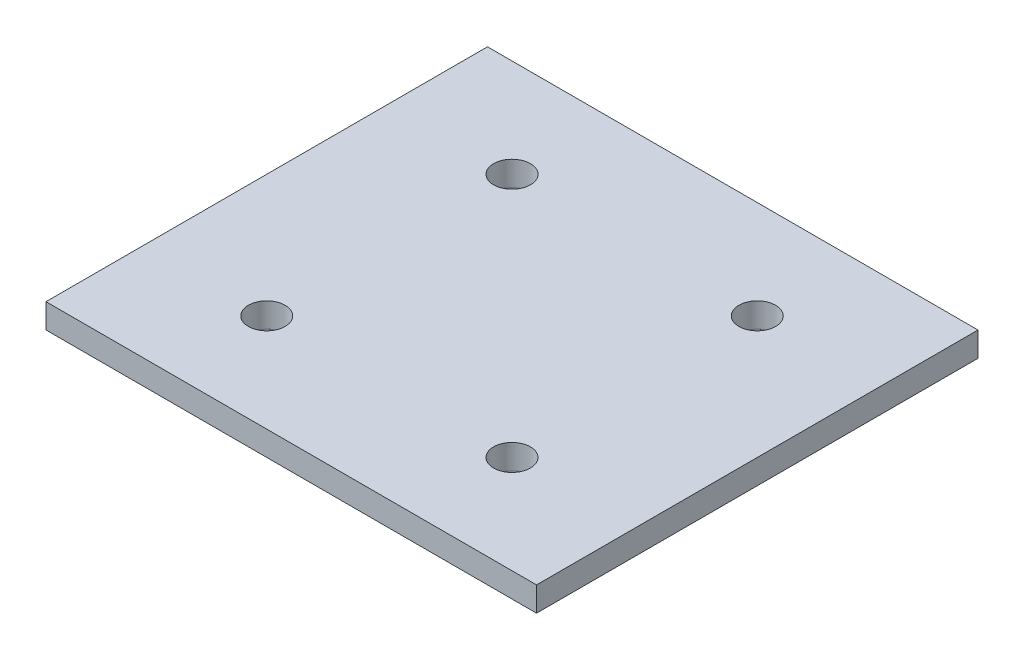
ISO-10303-21;
HEADER;
FILE_DESCRIPTION(('STEP AP214'),'2;1');
FILE_NAME('part.step','',(''),(''),'','','');
FILE_SCHEMA(('AUTOMOTIVE_DESIGN { 1 0 10303 214 1 1 1 1 }'));
ENDSEC;
DATA;
#1=APPLICATION_CONTEXT('core data for automotive mechanical design processes');
#2=APPLICATION_PROTOCOL_DEFINITION('international standard','automotive_design',2000,#1);
#3=PRODUCT_CONTEXT('',#1,'mechanical');
#4=PRODUCT('Part','Part','',(#3));
#5=PRODUCT_RELATED_PRODUCT_CATEGORY('part','',(#4));
#6=PRODUCT_DEFINITION_FORMATION('','',#4);
#7=PRODUCT_DEFINITION_CONTEXT('part definition',#1,'design');
#8=PRODUCT_DEFINITION('design','',#6,#7);
#9=PRODUCT_DEFINITION_SHAPE('','',#8);
#10=(LENGTH_UNIT() NAMED_UNIT(*) SI_UNIT(.MILLI.,.METRE.));
#11=(NAMED_UNIT(*) PLANE_ANGLE_UNIT() SI_UNIT($,.RADIAN.));
#12=(NAMED_UNIT(*) SI_UNIT($,.STERADIAN.) SOLID_ANGLE_UNIT());
#13=UNCERTAINTY_MEASURE_WITH_UNIT(LENGTH_MEASURE(1.E-05),#10,'distance_accuracy_value','');
#14=(GEOMETRIC_REPRESENTATION_CONTEXT(3) GLOBAL_UNCERTAINTY_ASSIGNED_CONTEXT((#13)) GLOBAL_UNIT_ASSIGNED_CONTEXT((#10,
#11,#12)) REPRESENTATION_CONTEXT('',''));
#15=CARTESIAN_POINT('',(0.,0.,0.));
#16=DIRECTION('',(0.,0.,1.));
#17=DIRECTION('',(1.,0.,0.));
#18=AXIS2_PLACEMENT_3D('',#15,#16,#17);
#19=CARTESIAN_POINT('',(-10.,-5.,-10.));
#20=DIRECTION('',(0.,1.,0.));
#21=DIRECTION('',(0.,0.,1.));
#22=AXIS2_PLACEMENT_3D('',#19,#20,#21);
#23=PLANE('',#22);
#24=CARTESIAN_POINT('',(-10.,-5.,-10.));
#25=DIRECTION('',(0.,-1.,0.));
#26=DIRECTION('',(0.,0.,1.));
#27=AXIS2_PLACEMENT_3D('',#24,#25,#26);
#28=CIRCLE('',#27,3.);
#29=CARTESIAN_POINT('',(-10.,-5.,-7.));
#30=VERTEX_POINT('',#29);
#31=EDGE_CURVE('E63',#30,#30,#28,.T.);
#32=ORIENTED_EDGE('',*,*,#31,.T.);
#33=EDGE_LOOP('',(#32));
#34=FACE_BOUND('',#33,.T.);
#35=CARTESIAN_POINT('',(-10.,-5.,-10.));
#36=DIRECTION('',(0.,-1.,0.));
#37=DIRECTION('',(0.,0.,1.));
#38=AXIS2_PLACEMENT_3D('',#35,#36,#37);
#39=CIRCLE('',#38,1.50000000000013);
#40=CARTESIAN_POINT('',(-10.,-5.,-8.49999999999987));
#41=VERTEX_POINT('',#40);
#42=EDGE_CURVE('E54',#41,#41,#39,.T.);
#43=ORIENTED_EDGE('',*,*,#42,.F.);
#44=EDGE_LOOP('',(#43));
#45=FACE_BOUND('',#44,.T.);
#46=ADVANCED_FACE('F50',(#34,#45),#23,.F.);
#47=CARTESIAN_POINT('',(-10.,0.,-10.));
#48=DIRECTION('',(0.,1.,0.));
#49=DIRECTION('',(0.,0.,1.));
#50=AXIS2_PLACEMENT_3D('',#47,#48,#49);
#51=PLANE('',#50);
#52=CARTESIAN_POINT('',(-10.,0.,-10.));
#53=DIRECTION('',(0.,-1.,0.));
#54=DIRECTION('',(0.,0.,1.));
#55=AXIS2_PLACEMENT_3D('',#52,#53,#54);
#56=CIRCLE('',#55,3.);
#57=CARTESIAN_POINT('',(-10.,0.,-7.));
#58=VERTEX_POINT('',#57);
#59=EDGE_CURVE('E61',#58,#58,#56,.T.);
#60=ORIENTED_EDGE('',*,*,#59,.F.);
#61=EDGE_LOOP('',(#60));
#62=FACE_BOUND('',#61,.T.);
#63=CARTESIAN_POINT('',(-10.,0.,-10.));
#64=DIRECTION('',(0.,-1.,0.));
#65=DIRECTION('',(0.,0.,1.));
#66=AXIS2_PLACEMENT_3D('',#63,#64,#65);
#67=CIRCLE('',#66,1.50000000000013);
#68=CARTESIAN_POINT('',(-10.,0.,-8.49999999999987));
#69=VERTEX_POINT('',#68);
#70=EDGE_CURVE('E11',#69,#69,#67,.T.);
#71=ORIENTED_EDGE('',*,*,#70,.T.);
#72=EDGE_LOOP('',(#71));
#73=FACE_BOUND('',#72,.T.);
#74=ADVANCED_FACE('F71',(#62,#73),#51,.T.);
#75=CARTESIAN_POINT('',(-10.,-5.,-10.));
#76=DIRECTION('',(0.,1.,0.));
#77=DIRECTION('',(0.,0.,1.));
#78=AXIS2_PLACEMENT_3D('',#75,#76,#77);
#79=CYLINDRICAL_SURFACE('',#78,3.);
#80=ORIENTED_EDGE('',*,*,#31,.F.);
#81=EDGE_LOOP('',(#80));
#82=FACE_BOUND('',#81,.T.);
#83=ORIENTED_EDGE('',*,*,#59,.T.);
#84=EDGE_LOOP('',(#83));
#85=FACE_BOUND('',#84,.T.);
#86=ADVANCED_FACE('F69',(#82,#85),#79,.T.);
#87=CARTESIAN_POINT('',(-10.,-5.,-10.));
#88=DIRECTION('',(0.,1.,0.));
#89=DIRECTION('',(0.,0.,1.));
#90=AXIS2_PLACEMENT_3D('',#87,#88,#89);
#91=CYLINDRICAL_SURFACE('',#90,1.50000000000013);
#92=ORIENTED_EDGE('',*,*,#42,.T.);
#93=EDGE_LOOP('',(#92));
#94=FACE_BOUND('',#93,.T.);
#95=ORIENTED_EDGE('',*,*,#70,.F.);
#96=EDGE_LOOP('',(#95));
#97=FACE_BOUND('',#96,.T.);
#98=ADVANCED_FACE('F52',(#94,#97),#91,.F.);
#99=CLOSED_SHELL('',(#46,#74,#86,#98));
#100=MANIFOLD_SOLID_BREP('B2',#99);
#101=CARTESIAN_POINT('',(10.,-5.,-10.));
#102=DIRECTION('',(0.,-1.,0.));
#103=DIRECTION('',(0.,0.,-1.));
#104=AXIS2_PLACEMENT_3D('',#101,#102,#103);
#105=PLANE('',#104);
#106=CARTESIAN_POINT('',(10.,-5.,-10.));
#107=DIRECTION('',(0.,-1.,0.));
#108=DIRECTION('',(0.,0.,-1.));
#109=AXIS2_PLACEMENT_3D('',#106,#107,#108);
#110=CIRCLE('',#109,3.);
#111=CARTESIAN_POINT('',(10.,-5.,-13.));
#112=VERTEX_POINT('',#111);
#113=EDGE_CURVE('E141',#112,#112,#110,.T.);
#114=ORIENTED_EDGE('',*,*,#113,.T.);
#115=EDGE_LOOP('',(#114));
#116=FACE_BOUND('',#115,.T.);
#117=CARTESIAN_POINT('',(10.,-5.,-10.));
#118=DIRECTION('',(0.,-1.,0.));
#119=DIRECTION('',(0.,0.,-1.));
#120=AXIS2_PLACEMENT_3D('',#117,#118,#119);
#121=CIRCLE('',#120,1.50000000000013);
#122=CARTESIAN_POINT('',(10.,-5.,-11.5000000000001));
#123=VERTEX_POINT('',#122);
#124=EDGE_CURVE('E132',#123,#123,#121,.T.);
#125=ORIENTED_EDGE('',*,*,#124,.F.);
#126=EDGE_LOOP('',(#125));
#127=FACE_BOUND('',#126,.T.);
#128=ADVANCED_FACE('F128',(#116,#127),#105,.T.);
#129=CARTESIAN_POINT('',(10.,0.,-10.));
#130=DIRECTION('',(0.,-1.,0.));
#131=DIRECTION('',(0.,0.,-1.));
#132=AXIS2_PLACEMENT_3D('',#129,#130,#131);
#133=PLANE('',#132);
#134=CARTESIAN_POINT('',(10.,0.,-10.));
#135=DIRECTION('',(0.,-1.,0.));
#136=DIRECTION('',(0.,0.,-1.));
#137=AXIS2_PLACEMENT_3D('',#134,#135,#136);
#138=CIRCLE('',#137,3.);
#139=CARTESIAN_POINT('',(10.,0.,-13.));
#140=VERTEX_POINT('',#139);
#141=EDGE_CURVE('E139',#140,#140,#138,.T.);
#142=ORIENTED_EDGE('',*,*,#141,.F.);
#143=EDGE_LOOP('',(#142));
#144=FACE_BOUND('',#143,.T.);
#145=CARTESIAN_POINT('',(10.,0.,-10.));
#146=DIRECTION('',(0.,-1.,0.));
#147=DIRECTION('',(0.,0.,-1.));
#148=AXIS2_PLACEMENT_3D('',#145,#146,#147);
#149=CIRCLE('',#148,1.50000000000013);
#150=CARTESIAN_POINT('',(10.,0.,-11.5000000000001));
#151=VERTEX_POINT('',#150);
#152=EDGE_CURVE('E49',#151,#151,#149,.T.);
#153=ORIENTED_EDGE('',*,*,#152,.T.);
#154=EDGE_LOOP('',(#153));
#155=FACE_BOUND('',#154,.T.);
#156=ADVANCED_FACE('F149',(#144,#155),#133,.F.);
#157=CARTESIAN_POINT('',(10.,-5.,-10.));
#158=DIRECTION('',(0.,1.,0.));
#159=DIRECTION('',(0.,0.,1.));
#160=AXIS2_PLACEMENT_3D('',#157,#158,#159);
#161=CYLINDRICAL_SURFACE('',#160,3.);
#162=ORIENTED_EDGE('',*,*,#113,.F.);
#163=EDGE_LOOP('',(#162));
#164=FACE_BOUND('',#163,.T.);
#165=ORIENTED_EDGE('',*,*,#141,.T.);
#166=EDGE_LOOP('',(#165));
#167=FACE_BOUND('',#166,.T.);
#168=ADVANCED_FACE('F147',(#164,#167),#161,.T.);
#169=CARTESIAN_POINT('',(10.,-5.,-10.));
#170=DIRECTION('',(0.,1.,0.));
#171=DIRECTION('',(0.,0.,1.));
#172=AXIS2_PLACEMENT_3D('',#169,#170,#171);
#173=CYLINDRICAL_SURFACE('',#172,1.50000000000013);
#174=ORIENTED_EDGE('',*,*,#124,.T.);
#175=EDGE_LOOP('',(#174));
#176=FACE_BOUND('',#175,.T.);
#177=ORIENTED_EDGE('',*,*,#152,.F.);
#178=EDGE_LOOP('',(#177));
#179=FACE_BOUND('',#178,.T.);
#180=ADVANCED_FACE('F130',(#176,#179),#173,.F.);
#181=CLOSED_SHELL('',(#128,#156,#168,#180));
#182=MANIFOLD_SOLID_BREP('B6',#181);
#183=CARTESIAN_POINT('',(10.,-5.,10.));
#184=DIRECTION('',(0.,1.,0.));
#185=DIRECTION('',(0.,0.,1.));
#186=AXIS2_PLACEMENT_3D('',#183,#184,#185);
#187=PLANE('',#186);
#188=CARTESIAN_POINT('',(10.,-5.,10.));
#189=DIRECTION('',(0.,-1.,0.));
#190=DIRECTION('',(0.,0.,1.));
#191=AXIS2_PLACEMENT_3D('',#188,#189,#190);
#192=CIRCLE('',#191,3.);
#193=CARTESIAN_POINT('',(10.,-5.,13.));
#194=VERTEX_POINT('',#193);
#195=EDGE_CURVE('E219',#194,#194,#192,.T.);
#196=ORIENTED_EDGE('',*,*,#195,.T.);
#197=EDGE_LOOP('',(#196));
#198=FACE_BOUND('',#197,.T.);
#199=CARTESIAN_POINT('',(10.,-5.,10.));
#200=DIRECTION('',(0.,-1.,0.));
#201=DIRECTION('',(0.,0.,1.));
#202=AXIS2_PLACEMENT_3D('',#199,#200,#201);
#203=CIRCLE('',#202,1.50000000000013);
#204=CARTESIAN_POINT('',(10.,-5.,11.5000000000001));
#205=VERTEX_POINT('',#204);
#206=EDGE_CURVE('E210',#205,#205,#203,.T.);
#207=ORIENTED_EDGE('',*,*,#206,.F.);
#208=EDGE_LOOP('',(#207));
#209=FACE_BOUND('',#208,.T.);
#210=ADVANCED_FACE('F206',(#198,#209),#187,.F.);
#211=CARTESIAN_POINT('',(10.,0.,10.));
#212=DIRECTION('',(0.,1.,0.));
#213=DIRECTION('',(0.,0.,1.));
#214=AXIS2_PLACEMENT_3D('',#211,#212,#213);
#215=PLANE('',#214);
#216=CARTESIAN_POINT('',(10.,0.,10.));
#217=DIRECTION('',(0.,-1.,0.));
#218=DIRECTION('',(0.,0.,1.));
#219=AXIS2_PLACEMENT_3D('',#216,#217,#218);
#220=CIRCLE('',#219,3.);
#221=CARTESIAN_POINT('',(10.,0.,13.));
#222=VERTEX_POINT('',#221);
#223=EDGE_CURVE('E217',#222,#222,#220,.T.);
#224=ORIENTED_EDGE('',*,*,#223,.F.);
#225=EDGE_LOOP('',(#224));
#226=FACE_BOUND('',#225,.T.);
#227=CARTESIAN_POINT('',(10.,0.,10.));
#228=DIRECTION('',(0.,-1.,0.));
#229=DIRECTION('',(0.,0.,1.));
#230=AXIS2_PLACEMENT_3D('',#227,#228,#229);
#231=CIRCLE('',#230,1.50000000000013);
#232=CARTESIAN_POINT('',(10.,0.,11.5000000000001));
#233=VERTEX_POINT('',#232);
#234=EDGE_CURVE('E127',#233,#233,#231,.T.);
#235=ORIENTED_EDGE('',*,*,#234,.T.);
#236=EDGE_LOOP('',(#235));
#237=FACE_BOUND('',#236,.T.);
#238=ADVANCED_FACE('F227',(#226,#237),#215,.T.);
#239=CARTESIAN_POINT('',(10.,-5.,10.));
#240=DIRECTION('',(0.,1.,0.));
#241=DIRECTION('',(0.,0.,1.));
#242=AXIS2_PLACEMENT_3D('',#239,#240,#241);
#243=CYLINDRICAL_SURFACE('',#242,3.);
#244=ORIENTED_EDGE('',*,*,#195,.F.);
#245=EDGE_LOOP('',(#244));
#246=FACE_BOUND('',#245,.T.);
#247=ORIENTED_EDGE('',*,*,#223,.T.);
#248=EDGE_LOOP('',(#247));
#249=FACE_BOUND('',#248,.T.);
#250=ADVANCED_FACE('F225',(#246,#249),#243,.T.);
#251=CARTESIAN_POINT('',(10.,-5.,10.));
#252=DIRECTION('',(0.,1.,0.));
#253=DIRECTION('',(0.,0.,1.));
#254=AXIS2_PLACEMENT_3D('',#251,#252,#253);
#255=CYLINDRICAL_SURFACE('',#254,1.50000000000013);
#256=ORIENTED_EDGE('',*,*,#206,.T.);
#257=EDGE_LOOP('',(#256));
#258=FACE_BOUND('',#257,.T.);
#259=ORIENTED_EDGE('',*,*,#234,.F.);
#260=EDGE_LOOP('',(#259));
#261=FACE_BOUND('',#260,.T.);
#262=ADVANCED_FACE('F208',(#258,#261),#255,.F.);
#263=CLOSED_SHELL('',(#210,#238,#250,#262));
#264=MANIFOLD_SOLID_BREP('B44',#263);
#265=CARTESIAN_POINT('',(-10.,-5.,10.));
#266=DIRECTION('',(0.,-1.,0.));
#267=DIRECTION('',(0.,0.,-1.));
#268=AXIS2_PLACEMENT_3D('',#265,#266,#267);
#269=PLANE('',#268);
#270=CARTESIAN_POINT('',(-10.,-5.,10.));
#271=DIRECTION('',(0.,-1.,0.));
#272=DIRECTION('',(0.,0.,-1.));
#273=AXIS2_PLACEMENT_3D('',#270,#271,#272);
#274=CIRCLE('',#273,3.);
#275=CARTESIAN_POINT('',(-10.,-5.,7.));
#276=VERTEX_POINT('',#275);
#277=EDGE_CURVE('E205',#276,#276,#274,.T.);
#278=ORIENTED_EDGE('',*,*,#277,.T.);
#279=EDGE_LOOP('',(#278));
#280=FACE_BOUND('',#279,.T.);
#281=CARTESIAN_POINT('',(-10.,-5.,10.));
#282=DIRECTION('',(0.,-1.,0.));
#283=DIRECTION('',(0.,0.,-1.));
#284=AXIS2_PLACEMENT_3D('',#281,#282,#283);
#285=CIRCLE('',#284,1.50000000000013);
#286=CARTESIAN_POINT('',(-10.,-5.,8.49999999999987));
#287=VERTEX_POINT('',#286);
#288=EDGE_CURVE('E296',#287,#287,#285,.T.);
#289=ORIENTED_EDGE('',*,*,#288,.F.);
#290=EDGE_LOOP('',(#289));
#291=FACE_BOUND('',#290,.T.);
#292=ADVANCED_FACE('F285',(#280,#291),#269,.T.);
#293=CARTESIAN_POINT('',(-10.,0.,10.));
#294=DIRECTION('',(0.,-1.,0.));
#295=DIRECTION('',(0.,0.,-1.));
#296=AXIS2_PLACEMENT_3D('',#293,#294,#295);
#297=PLANE('',#296);
#298=CARTESIAN_POINT('',(-10.,0.,10.));
#299=DIRECTION('',(0.,-1.,0.));
#300=DIRECTION('',(0.,0.,-1.));
#301=AXIS2_PLACEMENT_3D('',#298,#299,#300);
#302=CIRCLE('',#301,3.);
#303=CARTESIAN_POINT('',(-10.,0.,7.));
#304=VERTEX_POINT('',#303);
#305=EDGE_CURVE('E289',#304,#304,#302,.T.);
#306=ORIENTED_EDGE('',*,*,#305,.F.);
#307=EDGE_LOOP('',(#306));
#308=FACE_BOUND('',#307,.T.);
#309=CARTESIAN_POINT('',(-10.,0.,10.));
#310=DIRECTION('',(0.,-1.,0.));
#311=DIRECTION('',(0.,0.,-1.));
#312=AXIS2_PLACEMENT_3D('',#309,#310,#311);
#313=CIRCLE('',#312,1.50000000000013);
#314=CARTESIAN_POINT('',(-10.,0.,8.49999999999987));
#315=VERTEX_POINT('',#314);
#316=EDGE_CURVE('E298',#315,#315,#313,.T.);
#317=ORIENTED_EDGE('',*,*,#316,.T.);
#318=EDGE_LOOP('',(#317));
#319=FACE_BOUND('',#318,.T.);
#320=ADVANCED_FACE('F308',(#308,#319),#297,.F.);
#321=CARTESIAN_POINT('',(-10.,-5.,10.));
#322=DIRECTION('',(0.,1.,0.));
#323=DIRECTION('',(0.,0.,1.));
#324=AXIS2_PLACEMENT_3D('',#321,#322,#323);
#325=CYLINDRICAL_SURFACE('',#324,3.);
#326=ORIENTED_EDGE('',*,*,#277,.F.);
#327=EDGE_LOOP('',(#326));
#328=FACE_BOUND('',#327,.T.);
#329=ORIENTED_EDGE('',*,*,#305,.T.);
#330=EDGE_LOOP('',(#329));
#331=FACE_BOUND('',#330,.T.);
#332=ADVANCED_FACE('F287',(#328,#331),#325,.T.);
#333=CARTESIAN_POINT('',(-10.,-5.,10.));
#334=DIRECTION('',(0.,1.,0.));
#335=DIRECTION('',(0.,0.,1.));
#336=AXIS2_PLACEMENT_3D('',#333,#334,#335);
#337=CYLINDRICAL_SURFACE('',#336,1.50000000000013);
#338=ORIENTED_EDGE('',*,*,#288,.T.);
#339=EDGE_LOOP('',(#338));
#340=FACE_BOUND('',#339,.T.);
#341=ORIENTED_EDGE('',*,*,#316,.F.);
#342=EDGE_LOOP('',(#341));
#343=FACE_BOUND('',#342,.T.);
#344=ADVANCED_FACE('F304',(#340,#343),#337,.F.);
#345=CLOSED_SHELL('',(#292,#320,#332,#344));
#346=MANIFOLD_SOLID_BREP('B122',#345);
#347=CARTESIAN_POINT('',(0.,2.,0.));
#348=DIRECTION('',(0.,1.,0.));
#349=DIRECTION('',(0.,0.,1.));
#350=AXIS2_PLACEMENT_3D('',#347,#348,#349);
#351=PLANE('',#350);
#352=CARTESIAN_POINT('',(10.,2.,10.));
#353=DIRECTION('',(0.,1.,0.));
#354=DIRECTION('',(0.,0.,1.));
#355=AXIS2_PLACEMENT_3D('',#352,#353,#354);
#356=CIRCLE('',#355,1.50000000000009);
#357=CARTESIAN_POINT('',(10.,2.,11.5000000000001));
#358=VERTEX_POINT('',#357);
#359=EDGE_CURVE('E458',#358,#358,#356,.T.);
#360=ORIENTED_EDGE('',*,*,#359,.F.);
#361=EDGE_LOOP('',(#360));
#362=FACE_BOUND('',#361,.T.);
#363=CARTESIAN_POINT('',(-10.,2.,-10.));
#364=DIRECTION('',(0.,1.,0.));
#365=DIRECTION('',(0.,0.,1.));
#366=AXIS2_PLACEMENT_3D('',#363,#364,#365);
#367=CIRCLE('',#366,1.5);
#368=CARTESIAN_POINT('',(-10.,2.,-8.5));
#369=VERTEX_POINT('',#368);
#370=EDGE_CURVE('E428',#369,#369,#367,.T.);
#371=ORIENTED_EDGE('',*,*,#370,.F.);
#372=EDGE_LOOP('',(#371));
#373=FACE_BOUND('',#372,.T.);
#374=DIRECTION('',(0.,0.,1.));
#375=VECTOR('',#374,1.);
#376=CARTESIAN_POINT('',(-20.,2.,18.));
#377=LINE('',#376,#375);
#378=CARTESIAN_POINT('',(-20.,2.,-18.));
#379=VERTEX_POINT('',#378);
#380=CARTESIAN_POINT('',(-20.,2.,18.));
#381=VERTEX_POINT('',#380);
#382=EDGE_CURVE('E408',#379,#381,#377,.T.);
#383=ORIENTED_EDGE('',*,*,#382,.T.);
#384=DIRECTION('',(1.,0.,0.));
#385=VECTOR('',#384,1.);
#386=CARTESIAN_POINT('',(20.,2.,18.));
#387=LINE('',#386,#385);
#388=CARTESIAN_POINT('',(20.,2.,18.));
#389=VERTEX_POINT('',#388);
#390=EDGE_CURVE('E403',#381,#389,#387,.T.);
#391=ORIENTED_EDGE('',*,*,#390,.T.);
#392=DIRECTION('',(0.,0.,-1.));
#393=VECTOR('',#392,1.);
#394=CARTESIAN_POINT('',(20.,2.,18.));
#395=LINE('',#394,#393);
#396=CARTESIAN_POINT('',(20.,2.,-18.));
#397=VERTEX_POINT('',#396);
#398=EDGE_CURVE('E406',#389,#397,#395,.T.);
#399=ORIENTED_EDGE('',*,*,#398,.T.);
#400=DIRECTION('',(-1.,0.,0.));
#401=VECTOR('',#400,1.);
#402=CARTESIAN_POINT('',(20.,2.,-18.));
#403=LINE('',#402,#401);
#404=EDGE_CURVE('E373',#397,#379,#403,.T.);
#405=ORIENTED_EDGE('',*,*,#404,.T.);
#406=EDGE_LOOP('',(#383,#391,#399,#405));
#407=FACE_BOUND('',#406,.T.);
#408=CARTESIAN_POINT('',(10.,2.,-10.));
#409=DIRECTION('',(0.,1.,0.));
#410=DIRECTION('',(0.,0.,1.));
#411=AXIS2_PLACEMENT_3D('',#408,#409,#410);
#412=CIRCLE('',#411,1.50000000000004);
#413=CARTESIAN_POINT('',(10.,2.,-8.49999999999996));
#414=VERTEX_POINT('',#413);
#415=EDGE_CURVE('E450',#414,#414,#412,.T.);
#416=ORIENTED_EDGE('',*,*,#415,.F.);
#417=EDGE_LOOP('',(#416));
#418=FACE_BOUND('',#417,.T.);
#419=CARTESIAN_POINT('',(-10.,2.,10.));
#420=DIRECTION('',(0.,1.,0.));
#421=DIRECTION('',(0.,0.,1.));
#422=AXIS2_PLACEMENT_3D('',#419,#420,#421);
#423=CIRCLE('',#422,1.50000000000013);
#424=CARTESIAN_POINT('',(-10.,2.,11.5000000000001));
#425=VERTEX_POINT('',#424);
#426=EDGE_CURVE('E466',#425,#425,#423,.T.);
#427=ORIENTED_EDGE('',*,*,#426,.F.);
#428=EDGE_LOOP('',(#427));
#429=FACE_BOUND('',#428,.T.);
#430=ADVANCED_FACE('F355',(#362,#373,#407,#418,#429),#351,.T.);
#431=CARTESIAN_POINT('',(0.,0.,0.));
#432=DIRECTION('',(0.,1.,0.));
#433=DIRECTION('',(0.,0.,1.));
#434=AXIS2_PLACEMENT_3D('',#431,#432,#433);
#435=PLANE('',#434);
#436=DIRECTION('',(0.,0.,1.));
#437=VECTOR('',#436,1.);
#438=CARTESIAN_POINT('',(-20.,0.,18.));
#439=LINE('',#438,#437);
#440=CARTESIAN_POINT('',(-20.,0.,-18.));
#441=VERTEX_POINT('',#440);
#442=CARTESIAN_POINT('',(-20.,0.,18.));
#443=VERTEX_POINT('',#442);
#444=EDGE_CURVE('E424',#441,#443,#439,.T.);
#445=ORIENTED_EDGE('',*,*,#444,.F.);
#446=DIRECTION('',(-1.,0.,0.));
#447=VECTOR('',#446,1.);
#448=CARTESIAN_POINT('',(20.,0.,-18.));
#449=LINE('',#448,#447);
#450=CARTESIAN_POINT('',(20.,0.,-18.));
#451=VERTEX_POINT('',#450);
#452=EDGE_CURVE('E396',#451,#441,#449,.T.);
#453=ORIENTED_EDGE('',*,*,#452,.F.);
#454=DIRECTION('',(0.,0.,-1.));
#455=VECTOR('',#454,1.);
#456=CARTESIAN_POINT('',(20.,0.,18.));
#457=LINE('',#456,#455);
#458=CARTESIAN_POINT('',(20.,0.,18.));
#459=VERTEX_POINT('',#458);
#460=EDGE_CURVE('E390',#459,#451,#457,.T.);
#461=ORIENTED_EDGE('',*,*,#460,.F.);
#462=DIRECTION('',(1.,0.,0.));
#463=VECTOR('',#462,1.);
#464=CARTESIAN_POINT('',(20.,0.,18.));
#465=LINE('',#464,#463);
#466=EDGE_CURVE('E413',#443,#459,#465,.T.);
#467=ORIENTED_EDGE('',*,*,#466,.F.);
#468=EDGE_LOOP('',(#445,#453,#461,#467));
#469=FACE_BOUND('',#468,.T.);
#470=CARTESIAN_POINT('',(-10.,0.,-10.));
#471=DIRECTION('',(0.,1.,0.));
#472=DIRECTION('',(0.,0.,1.));
#473=AXIS2_PLACEMENT_3D('',#470,#471,#472);
#474=CIRCLE('',#473,1.5);
#475=CARTESIAN_POINT('',(-10.,0.,-8.5));
#476=VERTEX_POINT('',#475);
#477=EDGE_CURVE('E446',#476,#476,#474,.T.);
#478=ORIENTED_EDGE('',*,*,#477,.T.);
#479=EDGE_LOOP('',(#478));
#480=FACE_BOUND('',#479,.T.);
#481=CARTESIAN_POINT('',(10.,0.,-10.));
#482=DIRECTION('',(0.,1.,0.));
#483=DIRECTION('',(0.,0.,1.));
#484=AXIS2_PLACEMENT_3D('',#481,#482,#483);
#485=CIRCLE('',#484,1.50000000000004);
#486=CARTESIAN_POINT('',(10.,0.,-8.49999999999996));
#487=VERTEX_POINT('',#486);
#488=EDGE_CURVE('E454',#487,#487,#485,.T.);
#489=ORIENTED_EDGE('',*,*,#488,.T.);
#490=EDGE_LOOP('',(#489));
#491=FACE_BOUND('',#490,.T.);
#492=CARTESIAN_POINT('',(10.,0.,10.));
#493=DIRECTION('',(0.,1.,0.));
#494=DIRECTION('',(0.,0.,1.));
#495=AXIS2_PLACEMENT_3D('',#492,#493,#494);
#496=CIRCLE('',#495,1.50000000000009);
#497=CARTESIAN_POINT('',(10.,0.,11.5000000000001));
#498=VERTEX_POINT('',#497);
#499=EDGE_CURVE('E462',#498,#498,#496,.T.);
#500=ORIENTED_EDGE('',*,*,#499,.T.);
#501=EDGE_LOOP('',(#500));
#502=FACE_BOUND('',#501,.T.);
#503=CARTESIAN_POINT('',(-10.,0.,10.));
#504=DIRECTION('',(0.,1.,0.));
#505=DIRECTION('',(0.,0.,1.));
#506=AXIS2_PLACEMENT_3D('',#503,#504,#505);
#507=CIRCLE('',#506,1.50000000000013);
#508=CARTESIAN_POINT('',(-10.,0.,11.5000000000001));
#509=VERTEX_POINT('',#508);
#510=EDGE_CURVE('E470',#509,#509,#507,.T.);
#511=ORIENTED_EDGE('',*,*,#510,.T.);
#512=EDGE_LOOP('',(#511));
#513=FACE_BOUND('',#512,.T.);
#514=ADVANCED_FACE('F441',(#469,#480,#491,#502,#513),#435,.F.);
#515=CARTESIAN_POINT('',(-20.,2.,18.));
#516=DIRECTION('',(1.,0.,0.));
#517=DIRECTION('',(0.,0.,-1.));
#518=AXIS2_PLACEMENT_3D('',#515,#516,#517);
#519=PLANE('',#518);
#520=ORIENTED_EDGE('',*,*,#444,.T.);
#521=DIRECTION('',(0.,-1.,0.));
#522=VECTOR('',#521,1.);
#523=CARTESIAN_POINT('',(-20.,2.,18.));
#524=LINE('',#523,#522);
#525=EDGE_CURVE('E283',#381,#443,#524,.T.);
#526=ORIENTED_EDGE('',*,*,#525,.F.);
#527=ORIENTED_EDGE('',*,*,#382,.F.);
#528=DIRECTION('',(0.,-1.,0.));
#529=VECTOR('',#528,1.);
#530=CARTESIAN_POINT('',(-20.,2.,-18.));
#531=LINE('',#530,#529);
#532=EDGE_CURVE('E420',#379,#441,#531,.T.);
#533=ORIENTED_EDGE('',*,*,#532,.T.);
#534=EDGE_LOOP('',(#520,#526,#527,#533));
#535=FACE_BOUND('',#534,.T.);
#536=ADVANCED_FACE('F357',(#535),#519,.F.);
#537=CARTESIAN_POINT('',(20.,2.,18.));
#538=DIRECTION('',(0.,0.,-1.));
#539=DIRECTION('',(-1.,0.,0.));
#540=AXIS2_PLACEMENT_3D('',#537,#538,#539);
#541=PLANE('',#540);
#542=ORIENTED_EDGE('',*,*,#466,.T.);
#543=DIRECTION('',(0.,-1.,0.));
#544=VECTOR('',#543,1.);
#545=CARTESIAN_POINT('',(20.,2.,18.));
#546=LINE('',#545,#544);
#547=EDGE_CURVE('E365',#389,#459,#546,.T.);
#548=ORIENTED_EDGE('',*,*,#547,.F.);
#549=ORIENTED_EDGE('',*,*,#390,.F.);
#550=ORIENTED_EDGE('',*,*,#525,.T.);
#551=EDGE_LOOP('',(#542,#548,#549,#550));
#552=FACE_BOUND('',#551,.T.);
#553=ADVANCED_FACE('F412',(#552),#541,.F.);
#554=CARTESIAN_POINT('',(20.,2.,18.));
#555=DIRECTION('',(-1.,0.,0.));
#556=DIRECTION('',(0.,0.,1.));
#557=AXIS2_PLACEMENT_3D('',#554,#555,#556);
#558=PLANE('',#557);
#559=ORIENTED_EDGE('',*,*,#460,.T.);
#560=DIRECTION('',(0.,-1.,0.));
#561=VECTOR('',#560,1.);
#562=CARTESIAN_POINT('',(20.,2.,-18.));
#563=LINE('',#562,#561);
#564=EDGE_CURVE('E415',#397,#451,#563,.T.);
#565=ORIENTED_EDGE('',*,*,#564,.F.);
#566=ORIENTED_EDGE('',*,*,#398,.F.);
#567=ORIENTED_EDGE('',*,*,#547,.T.);
#568=EDGE_LOOP('',(#559,#565,#566,#567));
#569=FACE_BOUND('',#568,.T.);
#570=ADVANCED_FACE('F416',(#569),#558,.F.);
#571=CARTESIAN_POINT('',(20.,2.,-18.));
#572=DIRECTION('',(0.,0.,1.));
#573=DIRECTION('',(1.,0.,0.));
#574=AXIS2_PLACEMENT_3D('',#571,#572,#573);
#575=PLANE('',#574);
#576=ORIENTED_EDGE('',*,*,#452,.T.);
#577=ORIENTED_EDGE('',*,*,#532,.F.);
#578=ORIENTED_EDGE('',*,*,#404,.F.);
#579=ORIENTED_EDGE('',*,*,#564,.T.);
#580=EDGE_LOOP('',(#576,#577,#578,#579));
#581=FACE_BOUND('',#580,.T.);
#582=ADVANCED_FACE('F438',(#581),#575,.F.);
#583=CARTESIAN_POINT('',(-10.,2.,-10.));
#584=DIRECTION('',(0.,-1.,0.));
#585=DIRECTION('',(0.,0.,-1.));
#586=AXIS2_PLACEMENT_3D('',#583,#584,#585);
#587=CYLINDRICAL_SURFACE('',#586,1.5);
#588=ORIENTED_EDGE('',*,*,#370,.T.);
#589=EDGE_LOOP('',(#588));
#590=FACE_BOUND('',#589,.T.);
#591=ORIENTED_EDGE('',*,*,#477,.F.);
#592=EDGE_LOOP('',(#591));
#593=FACE_BOUND('',#592,.T.);
#594=ADVANCED_FACE('F491',(#590,#593),#587,.F.);
#595=CARTESIAN_POINT('',(10.,2.,-10.));
#596=DIRECTION('',(0.,-1.,0.));
#597=DIRECTION('',(0.,0.,-1.));
#598=AXIS2_PLACEMENT_3D('',#595,#596,#597);
#599=CYLINDRICAL_SURFACE('',#598,1.50000000000004);
#600=ORIENTED_EDGE('',*,*,#415,.T.);
#601=EDGE_LOOP('',(#600));
#602=FACE_BOUND('',#601,.T.);
#603=ORIENTED_EDGE('',*,*,#488,.F.);
#604=EDGE_LOOP('',(#603));
#605=FACE_BOUND('',#604,.T.);
#606=ADVANCED_FACE('F545',(#602,#605),#599,.F.);
#607=CARTESIAN_POINT('',(10.,2.,10.));
#608=DIRECTION('',(0.,-1.,0.));
#609=DIRECTION('',(0.,0.,-1.));
#610=AXIS2_PLACEMENT_3D('',#607,#608,#609);
#611=CYLINDRICAL_SURFACE('',#610,1.50000000000009);
#612=ORIENTED_EDGE('',*,*,#359,.T.);
#613=EDGE_LOOP('',(#612));
#614=FACE_BOUND('',#613,.T.);
#615=ORIENTED_EDGE('',*,*,#499,.F.);
#616=EDGE_LOOP('',(#615));
#617=FACE_BOUND('',#616,.T.);
#618=ADVANCED_FACE('F554',(#614,#617),#611,.F.);
#619=CARTESIAN_POINT('',(-10.,2.,10.));
#620=DIRECTION('',(0.,-1.,0.));
#621=DIRECTION('',(0.,0.,-1.));
#622=AXIS2_PLACEMENT_3D('',#619,#620,#621);
#623=CYLINDRICAL_SURFACE('',#622,1.50000000000013);
#624=ORIENTED_EDGE('',*,*,#426,.T.);
#625=EDGE_LOOP('',(#624));
#626=FACE_BOUND('',#625,.T.);
#627=ORIENTED_EDGE('',*,*,#510,.F.);
#628=EDGE_LOOP('',(#627));
#629=FACE_BOUND('',#628,.T.);
#630=ADVANCED_FACE('F478',(#626,#629),#623,.F.);
#631=CLOSED_SHELL('',(#430,#514,#536,#553,#570,#582,#594,#606,#618,#630));
#632=MANIFOLD_SOLID_BREP('B200',#631);
#633=ADVANCED_BREP_SHAPE_REPRESENTATION('',(#18,#100,#182,#264,#346,#632),#14);
#634=SHAPE_DEFINITION_REPRESENTATION(#9,#633);
ENDSEC;
END-ISO-10303-21;
